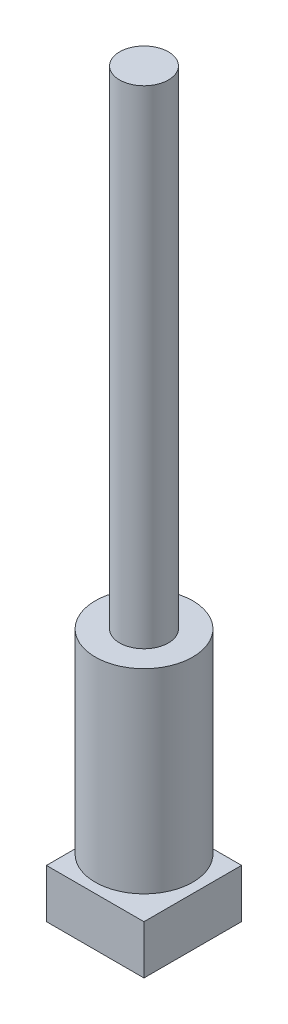
ISO-10303-21;
HEADER;
FILE_DESCRIPTION(('STEP AP214'),'2;1');
FILE_NAME('part.step','',(''),(''),'','','');
FILE_SCHEMA(('AUTOMOTIVE_DESIGN { 1 0 10303 214 1 1 1 1 }'));
ENDSEC;
DATA;
#1=APPLICATION_CONTEXT('core data for automotive mechanical design processes');
#2=APPLICATION_PROTOCOL_DEFINITION('international standard','automotive_design',2000,#1);
#3=PRODUCT_CONTEXT('',#1,'mechanical');
#4=PRODUCT('Part','Part','',(#3));
#5=PRODUCT_RELATED_PRODUCT_CATEGORY('part','',(#4));
#6=PRODUCT_DEFINITION_FORMATION('','',#4);
#7=PRODUCT_DEFINITION_CONTEXT('part definition',#1,'design');
#8=PRODUCT_DEFINITION('design','',#6,#7);
#9=PRODUCT_DEFINITION_SHAPE('','',#8);
#10=(LENGTH_UNIT() NAMED_UNIT(*) SI_UNIT(.MILLI.,.METRE.));
#11=(NAMED_UNIT(*) PLANE_ANGLE_UNIT() SI_UNIT($,.RADIAN.));
#12=(NAMED_UNIT(*) SI_UNIT($,.STERADIAN.) SOLID_ANGLE_UNIT());
#13=UNCERTAINTY_MEASURE_WITH_UNIT(LENGTH_MEASURE(1.E-05),#10,'distance_accuracy_value','');
#14=(GEOMETRIC_REPRESENTATION_CONTEXT(3) GLOBAL_UNCERTAINTY_ASSIGNED_CONTEXT((#13)) GLOBAL_UNIT_ASSIGNED_CONTEXT((#10,
#11,#12)) REPRESENTATION_CONTEXT('',''));
#15=CARTESIAN_POINT('',(0.,0.,0.));
#16=DIRECTION('',(0.,0.,1.));
#17=DIRECTION('',(1.,0.,0.));
#18=AXIS2_PLACEMENT_3D('',#15,#16,#17);
#19=CARTESIAN_POINT('',(50.,-260.,-50.0443868080652));
#20=DIRECTION('',(-1.,0.,0.));
#21=DIRECTION('',(0.,0.,1.));
#22=AXIS2_PLACEMENT_3D('',#19,#20,#21);
#23=PLANE('',#22);
#24=DIRECTION('',(0.,0.,1.));
#25=VECTOR('',#24,1.);
#26=CARTESIAN_POINT('',(50.,-210.,-50.0443868080652));
#27=LINE('',#26,#25);
#28=CARTESIAN_POINT('',(50.,-210.,-50.0443868080652));
#29=VERTEX_POINT('',#28);
#30=CARTESIAN_POINT('',(50.,-210.,50.0443868080652));
#31=VERTEX_POINT('',#30);
#32=EDGE_CURVE('E104',#29,#31,#27,.T.);
#33=ORIENTED_EDGE('',*,*,#32,.T.);
#34=DIRECTION('',(0.,1.,0.));
#35=VECTOR('',#34,1.);
#36=CARTESIAN_POINT('',(50.,-260.,50.0443868080652));
#37=LINE('',#36,#35);
#38=CARTESIAN_POINT('',(50.,-260.,50.0443868080652));
#39=VERTEX_POINT('',#38);
#40=EDGE_CURVE('E12',#39,#31,#37,.T.);
#41=ORIENTED_EDGE('',*,*,#40,.F.);
#42=DIRECTION('',(0.,0.,1.));
#43=VECTOR('',#42,1.);
#44=CARTESIAN_POINT('',(50.,-260.,-50.0443868080652));
#45=LINE('',#44,#43);
#46=CARTESIAN_POINT('',(50.,-260.,-50.0443868080652));
#47=VERTEX_POINT('',#46);
#48=EDGE_CURVE('E92',#47,#39,#45,.T.);
#49=ORIENTED_EDGE('',*,*,#48,.F.);
#50=DIRECTION('',(0.,1.,0.));
#51=VECTOR('',#50,1.);
#52=CARTESIAN_POINT('',(50.,-260.,-50.0443868080652));
#53=LINE('',#52,#51);
#54=EDGE_CURVE('E100',#47,#29,#53,.T.);
#55=ORIENTED_EDGE('',*,*,#54,.T.);
#56=EDGE_LOOP('',(#33,#41,#49,#55));
#57=FACE_BOUND('',#56,.T.);
#58=ADVANCED_FACE('F41',(#57),#23,.F.);
#59=CARTESIAN_POINT('',(50.,-260.,50.0443868080652));
#60=DIRECTION('',(0.,0.,-1.));
#61=DIRECTION('',(-1.,0.,0.));
#62=AXIS2_PLACEMENT_3D('',#59,#60,#61);
#63=PLANE('',#62);
#64=DIRECTION('',(-1.,0.,0.));
#65=VECTOR('',#64,1.);
#66=CARTESIAN_POINT('',(50.,-210.,50.0443868080652));
#67=LINE('',#66,#65);
#68=CARTESIAN_POINT('',(-50.,-210.,50.0443868080652));
#69=VERTEX_POINT('',#68);
#70=EDGE_CURVE('E96',#31,#69,#67,.T.);
#71=ORIENTED_EDGE('',*,*,#70,.T.);
#72=DIRECTION('',(0.,1.,0.));
#73=VECTOR('',#72,1.);
#74=CARTESIAN_POINT('',(-50.,-260.,50.0443868080652));
#75=LINE('',#74,#73);
#76=CARTESIAN_POINT('',(-50.,-260.,50.0443868080652));
#77=VERTEX_POINT('',#76);
#78=EDGE_CURVE('E49',#77,#69,#75,.T.);
#79=ORIENTED_EDGE('',*,*,#78,.F.);
#80=DIRECTION('',(-1.,0.,0.));
#81=VECTOR('',#80,1.);
#82=CARTESIAN_POINT('',(50.,-260.,50.0443868080652));
#83=LINE('',#82,#81);
#84=EDGE_CURVE('E87',#39,#77,#83,.T.);
#85=ORIENTED_EDGE('',*,*,#84,.F.);
#86=ORIENTED_EDGE('',*,*,#40,.T.);
#87=EDGE_LOOP('',(#71,#79,#85,#86));
#88=FACE_BOUND('',#87,.T.);
#89=ADVANCED_FACE('F95',(#88),#63,.F.);
#90=CARTESIAN_POINT('',(-50.,-260.,-50.0443868080652));
#91=DIRECTION('',(1.,0.,0.));
#92=DIRECTION('',(0.,0.,-1.));
#93=AXIS2_PLACEMENT_3D('',#90,#91,#92);
#94=PLANE('',#93);
#95=DIRECTION('',(0.,0.,-1.));
#96=VECTOR('',#95,1.);
#97=CARTESIAN_POINT('',(-50.,-210.,-50.0443868080652));
#98=LINE('',#97,#96);
#99=CARTESIAN_POINT('',(-50.,-210.,-50.0443868080652));
#100=VERTEX_POINT('',#99);
#101=EDGE_CURVE('E74',#69,#100,#98,.T.);
#102=ORIENTED_EDGE('',*,*,#101,.T.);
#103=DIRECTION('',(0.,1.,0.));
#104=VECTOR('',#103,1.);
#105=CARTESIAN_POINT('',(-50.,-260.,-50.0443868080652));
#106=LINE('',#105,#104);
#107=CARTESIAN_POINT('',(-50.,-260.,-50.0443868080652));
#108=VERTEX_POINT('',#107);
#109=EDGE_CURVE('E97',#108,#100,#106,.T.);
#110=ORIENTED_EDGE('',*,*,#109,.F.);
#111=DIRECTION('',(0.,0.,-1.));
#112=VECTOR('',#111,1.);
#113=CARTESIAN_POINT('',(-50.,-260.,-50.0443868080652));
#114=LINE('',#113,#112);
#115=EDGE_CURVE('E90',#77,#108,#114,.T.);
#116=ORIENTED_EDGE('',*,*,#115,.F.);
#117=ORIENTED_EDGE('',*,*,#78,.T.);
#118=EDGE_LOOP('',(#102,#110,#116,#117));
#119=FACE_BOUND('',#118,.T.);
#120=ADVANCED_FACE('F98',(#119),#94,.F.);
#121=CARTESIAN_POINT('',(50.,-260.,-50.0443868080652));
#122=DIRECTION('',(0.,0.,1.));
#123=DIRECTION('',(1.,0.,0.));
#124=AXIS2_PLACEMENT_3D('',#121,#122,#123);
#125=PLANE('',#124);
#126=DIRECTION('',(1.,0.,0.));
#127=VECTOR('',#126,1.);
#128=CARTESIAN_POINT('',(50.,-210.,-50.0443868080652));
#129=LINE('',#128,#127);
#130=EDGE_CURVE('E80',#100,#29,#129,.T.);
#131=ORIENTED_EDGE('',*,*,#130,.T.);
#132=ORIENTED_EDGE('',*,*,#54,.F.);
#133=DIRECTION('',(1.,0.,0.));
#134=VECTOR('',#133,1.);
#135=CARTESIAN_POINT('',(50.,-260.,-50.0443868080652));
#136=LINE('',#135,#134);
#137=EDGE_CURVE('E57',#108,#47,#136,.T.);
#138=ORIENTED_EDGE('',*,*,#137,.F.);
#139=ORIENTED_EDGE('',*,*,#109,.T.);
#140=EDGE_LOOP('',(#131,#132,#138,#139));
#141=FACE_BOUND('',#140,.T.);
#142=ADVANCED_FACE('F111',(#141),#125,.F.);
#143=CARTESIAN_POINT('',(0.,-260.,0.));
#144=DIRECTION('',(0.,-1.,0.));
#145=DIRECTION('',(0.,0.,-1.));
#146=AXIS2_PLACEMENT_3D('',#143,#144,#145);
#147=PLANE('',#146);
#148=ORIENTED_EDGE('',*,*,#48,.T.);
#149=ORIENTED_EDGE('',*,*,#84,.T.);
#150=ORIENTED_EDGE('',*,*,#115,.T.);
#151=ORIENTED_EDGE('',*,*,#137,.T.);
#152=EDGE_LOOP('',(#148,#149,#150,#151));
#153=FACE_BOUND('',#152,.T.);
#154=ADVANCED_FACE('F88',(#153),#147,.T.);
#155=CARTESIAN_POINT('',(0.,-210.,0.));
#156=DIRECTION('',(0.,-1.,0.));
#157=DIRECTION('',(0.,0.,-1.));
#158=AXIS2_PLACEMENT_3D('',#155,#156,#157);
#159=PLANE('',#158);
#160=ORIENTED_EDGE('',*,*,#32,.F.);
#161=ORIENTED_EDGE('',*,*,#130,.F.);
#162=ORIENTED_EDGE('',*,*,#101,.F.);
#163=ORIENTED_EDGE('',*,*,#70,.F.);
#164=EDGE_LOOP('',(#160,#161,#162,#163));
#165=FACE_BOUND('',#164,.T.);
#166=ADVANCED_FACE('F114',(#165),#159,.F.);
#167=CLOSED_SHELL('',(#58,#89,#120,#142,#154,#166));
#168=MANIFOLD_SOLID_BREP('B2',#167);
#169=CARTESIAN_POINT('',(-50.,-200.,0.));
#170=DIRECTION('',(0.,1.,0.));
#171=DIRECTION('',(0.,0.,1.));
#172=AXIS2_PLACEMENT_3D('',#169,#170,#171);
#173=PLANE('',#172);
#174=CARTESIAN_POINT('',(0.,-200.,0.));
#175=DIRECTION('',(0.,-1.,0.));
#176=DIRECTION('',(0.,0.,-1.));
#177=AXIS2_PLACEMENT_3D('',#174,#175,#176);
#178=CIRCLE('',#177,50.);
#179=CARTESIAN_POINT('',(0.,-200.,-50.));
#180=VERTEX_POINT('',#179);
#181=EDGE_CURVE('E40',#180,#180,#178,.T.);
#182=ORIENTED_EDGE('',*,*,#181,.T.);
#183=EDGE_LOOP('',(#182));
#184=FACE_BOUND('',#183,.T.);
#185=ADVANCED_FACE('F164',(#184),#173,.F.);
#186=CARTESIAN_POINT('',(0.,0.,0.));
#187=DIRECTION('',(0.,-1.,0.));
#188=DIRECTION('',(0.,0.,-1.));
#189=AXIS2_PLACEMENT_3D('',#186,#187,#188);
#190=CYLINDRICAL_SURFACE('',#189,50.);
#191=ORIENTED_EDGE('',*,*,#181,.F.);
#192=EDGE_LOOP('',(#191));
#193=FACE_BOUND('',#192,.T.);
#194=CARTESIAN_POINT('',(0.,0.,0.));
#195=DIRECTION('',(0.,-1.,0.));
#196=DIRECTION('',(0.,0.,-1.));
#197=AXIS2_PLACEMENT_3D('',#194,#195,#196);
#198=CIRCLE('',#197,50.);
#199=CARTESIAN_POINT('',(0.,0.,-50.));
#200=VERTEX_POINT('',#199);
#201=EDGE_CURVE('E170',#200,#200,#198,.T.);
#202=ORIENTED_EDGE('',*,*,#201,.T.);
#203=EDGE_LOOP('',(#202));
#204=FACE_BOUND('',#203,.T.);
#205=ADVANCED_FACE('F196',(#193,#204),#190,.T.);
#206=CARTESIAN_POINT('',(-25.,0.,0.));
#207=DIRECTION('',(0.,-1.,0.));
#208=DIRECTION('',(0.,0.,-1.));
#209=AXIS2_PLACEMENT_3D('',#206,#207,#208);
#210=PLANE('',#209);
#211=ORIENTED_EDGE('',*,*,#201,.F.);
#212=EDGE_LOOP('',(#211));
#213=FACE_BOUND('',#212,.T.);
#214=CARTESIAN_POINT('',(0.,0.,0.));
#215=DIRECTION('',(0.,-1.,0.));
#216=DIRECTION('',(0.,0.,-1.));
#217=AXIS2_PLACEMENT_3D('',#214,#215,#216);
#218=CIRCLE('',#217,25.);
#219=CARTESIAN_POINT('',(0.,0.,-25.));
#220=VERTEX_POINT('',#219);
#221=EDGE_CURVE('E174',#220,#220,#218,.T.);
#222=ORIENTED_EDGE('',*,*,#221,.T.);
#223=EDGE_LOOP('',(#222));
#224=FACE_BOUND('',#223,.T.);
#225=ADVANCED_FACE('F192',(#213,#224),#210,.F.);
#226=CARTESIAN_POINT('',(0.,0.,0.));
#227=DIRECTION('',(0.,-1.,0.));
#228=DIRECTION('',(0.,0.,-1.));
#229=AXIS2_PLACEMENT_3D('',#226,#227,#228);
#230=CYLINDRICAL_SURFACE('',#229,25.);
#231=ORIENTED_EDGE('',*,*,#221,.F.);
#232=EDGE_LOOP('',(#231));
#233=FACE_BOUND('',#232,.T.);
#234=CARTESIAN_POINT('',(0.,500.,0.));
#235=DIRECTION('',(0.,-1.,0.));
#236=DIRECTION('',(0.,0.,-1.));
#237=AXIS2_PLACEMENT_3D('',#234,#235,#236);
#238=CIRCLE('',#237,25.);
#239=CARTESIAN_POINT('',(0.,500.,-25.));
#240=VERTEX_POINT('',#239);
#241=EDGE_CURVE('E178',#240,#240,#238,.T.);
#242=ORIENTED_EDGE('',*,*,#241,.T.);
#243=EDGE_LOOP('',(#242));
#244=FACE_BOUND('',#243,.T.);
#245=ADVANCED_FACE('F184',(#233,#244),#230,.T.);
#246=CARTESIAN_POINT('',(-25.,500.,0.));
#247=DIRECTION('',(0.,-1.,0.));
#248=DIRECTION('',(0.,0.,-1.));
#249=AXIS2_PLACEMENT_3D('',#246,#247,#248);
#250=PLANE('',#249);
#251=ORIENTED_EDGE('',*,*,#241,.F.);
#252=EDGE_LOOP('',(#251));
#253=FACE_BOUND('',#252,.T.);
#254=ADVANCED_FACE('F186',(#253),#250,.F.);
#255=CLOSED_SHELL('',(#185,#205,#225,#245,#254));
#256=MANIFOLD_SOLID_BREP('B6',#255);
#257=ADVANCED_BREP_SHAPE_REPRESENTATION('',(#18,#168,#256),#14);
#258=SHAPE_DEFINITION_REPRESENTATION(#9,#257);
ENDSEC;
END-ISO-10303-21;
